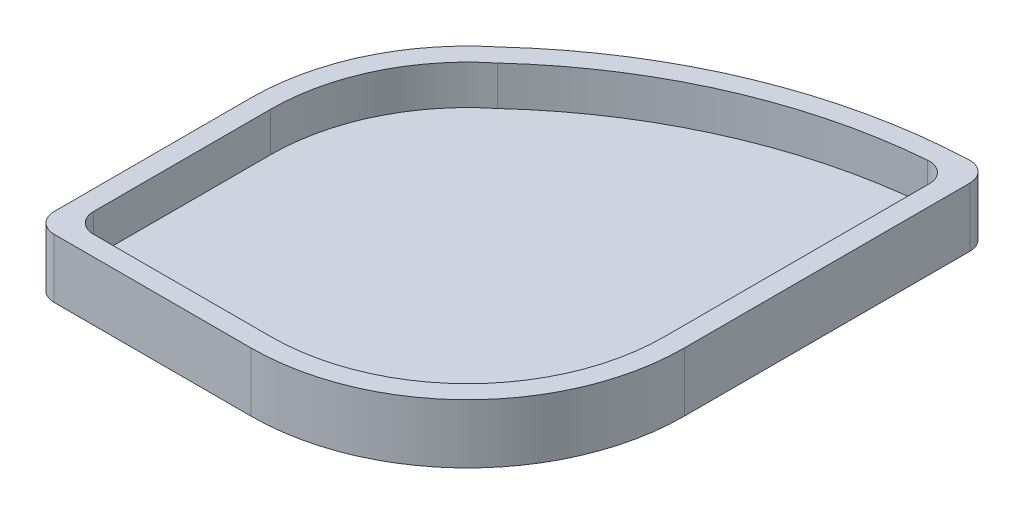
ISO-10303-21;
HEADER;
FILE_DESCRIPTION(('STEP AP214'),'2;1');
FILE_NAME('part.step','',(''),(''),'','','');
FILE_SCHEMA(('AUTOMOTIVE_DESIGN { 1 0 10303 214 1 1 1 1 }'));
ENDSEC;
DATA;
#1=APPLICATION_CONTEXT('core data for automotive mechanical design processes');
#2=APPLICATION_PROTOCOL_DEFINITION('international standard','automotive_design',2000,#1);
#3=PRODUCT_CONTEXT('',#1,'mechanical');
#4=PRODUCT('Part','Part','',(#3));
#5=PRODUCT_RELATED_PRODUCT_CATEGORY('part','',(#4));
#6=PRODUCT_DEFINITION_FORMATION('','',#4);
#7=PRODUCT_DEFINITION_CONTEXT('part definition',#1,'design');
#8=PRODUCT_DEFINITION('design','',#6,#7);
#9=PRODUCT_DEFINITION_SHAPE('','',#8);
#10=(LENGTH_UNIT() NAMED_UNIT(*) SI_UNIT(.MILLI.,.METRE.));
#11=(NAMED_UNIT(*) PLANE_ANGLE_UNIT() SI_UNIT($,.RADIAN.));
#12=(NAMED_UNIT(*) SI_UNIT($,.STERADIAN.) SOLID_ANGLE_UNIT());
#13=UNCERTAINTY_MEASURE_WITH_UNIT(LENGTH_MEASURE(1.E-05),#10,'distance_accuracy_value','');
#14=(GEOMETRIC_REPRESENTATION_CONTEXT(3) GLOBAL_UNCERTAINTY_ASSIGNED_CONTEXT((#13)) GLOBAL_UNIT_ASSIGNED_CONTEXT((#10,
#11,#12)) REPRESENTATION_CONTEXT('',''));
#15=CARTESIAN_POINT('',(0.,0.,0.));
#16=DIRECTION('',(0.,0.,1.));
#17=DIRECTION('',(1.,0.,0.));
#18=AXIS2_PLACEMENT_3D('',#15,#16,#17);
#19=CARTESIAN_POINT('',(0.,5.,0.));
#20=DIRECTION('',(0.,1.,0.));
#21=DIRECTION('',(0.,0.,1.));
#22=AXIS2_PLACEMENT_3D('',#19,#20,#21);
#23=CYLINDRICAL_SURFACE('',#22,50.);
#24=DIRECTION('',(0.,1.,0.));
#25=VECTOR('',#24,1.);
#26=CARTESIAN_POINT('',(0.,5.,50.));
#27=LINE('',#26,#25);
#28=CARTESIAN_POINT('',(0.,5.,50.));
#29=VERTEX_POINT('',#28);
#30=CARTESIAN_POINT('',(0.,15.,50.));
#31=VERTEX_POINT('',#30);
#32=EDGE_CURVE('E187',#29,#31,#27,.T.);
#33=ORIENTED_EDGE('',*,*,#32,.T.);
#34=CARTESIAN_POINT('',(0.,15.,0.));
#35=DIRECTION('',(0.,1.,0.));
#36=DIRECTION('',(0.,0.,1.));
#37=AXIS2_PLACEMENT_3D('',#34,#35,#36);
#38=CIRCLE('',#37,50.);
#39=CARTESIAN_POINT('',(50.,15.,0.));
#40=VERTEX_POINT('',#39);
#41=EDGE_CURVE('E204',#31,#40,#38,.T.);
#42=ORIENTED_EDGE('',*,*,#41,.T.);
#43=DIRECTION('',(0.,1.,0.));
#44=VECTOR('',#43,1.);
#45=CARTESIAN_POINT('',(50.,5.,0.));
#46=LINE('',#45,#44);
#47=CARTESIAN_POINT('',(50.,5.,0.));
#48=VERTEX_POINT('',#47);
#49=EDGE_CURVE('E277',#48,#40,#46,.T.);
#50=ORIENTED_EDGE('',*,*,#49,.F.);
#51=CARTESIAN_POINT('',(0.,5.,0.));
#52=DIRECTION('',(0.,1.,0.));
#53=DIRECTION('',(0.,0.,1.));
#54=AXIS2_PLACEMENT_3D('',#51,#52,#53);
#55=CIRCLE('',#54,50.);
#56=EDGE_CURVE('E195',#29,#48,#55,.T.);
#57=ORIENTED_EDGE('',*,*,#56,.F.);
#58=EDGE_LOOP('',(#33,#42,#50,#57));
#59=FACE_BOUND('',#58,.T.);
#60=ADVANCED_FACE('F52',(#59),#23,.F.);
#61=CARTESIAN_POINT('',(0.,15.,0.));
#62=DIRECTION('',(0.,-1.,0.));
#63=DIRECTION('',(0.,0.,-1.));
#64=AXIS2_PLACEMENT_3D('',#61,#62,#63);
#65=CYLINDRICAL_SURFACE('',#64,55.);
#66=DIRECTION('',(0.,-1.,0.));
#67=VECTOR('',#66,1.);
#68=CARTESIAN_POINT('',(-55.,15.,0.));
#69=LINE('',#68,#67);
#70=CARTESIAN_POINT('',(-55.,15.,0.));
#71=VERTEX_POINT('',#70);
#72=CARTESIAN_POINT('',(-55.,0.,0.));
#73=VERTEX_POINT('',#72);
#74=EDGE_CURVE('E258',#71,#73,#69,.T.);
#75=ORIENTED_EDGE('',*,*,#74,.F.);
#76=CARTESIAN_POINT('',(0.,15.,0.));
#77=DIRECTION('',(0.,1.,0.));
#78=DIRECTION('',(0.,0.,1.));
#79=AXIS2_PLACEMENT_3D('',#76,#77,#78);
#80=CIRCLE('',#79,55.);
#81=CARTESIAN_POINT('',(-34.617130436299,15.,-42.7393762279734));
#82=VERTEX_POINT('',#81);
#83=EDGE_CURVE('E205',#82,#71,#80,.T.);
#84=ORIENTED_EDGE('',*,*,#83,.F.);
#85=DIRECTION('',(0.,-1.,0.));
#86=VECTOR('',#85,1.);
#87=CARTESIAN_POINT('',(-34.617130436299,15.,-42.7393762279734));
#88=LINE('',#87,#86);
#89=CARTESIAN_POINT('',(-34.617130436299,0.,-42.7393762279734));
#90=VERTEX_POINT('',#89);
#91=EDGE_CURVE('E201',#82,#90,#88,.T.);
#92=ORIENTED_EDGE('',*,*,#91,.T.);
#93=CARTESIAN_POINT('',(0.,0.,0.));
#94=DIRECTION('',(0.,1.,0.));
#95=DIRECTION('',(0.,0.,1.));
#96=AXIS2_PLACEMENT_3D('',#93,#94,#95);
#97=CIRCLE('',#96,55.);
#98=EDGE_CURVE('E197',#90,#73,#97,.T.);
#99=ORIENTED_EDGE('',*,*,#98,.T.);
#100=EDGE_LOOP('',(#75,#84,#92,#99));
#101=FACE_BOUND('',#100,.T.);
#102=ADVANCED_FACE('F336',(#101),#65,.T.);
#103=CARTESIAN_POINT('',(0.,15.,55.));
#104=VERTEX_POINT('',#103);
#105=CARTESIAN_POINT('',(55.,15.,0.));
#106=VERTEX_POINT('',#105);
#107=EDGE_CURVE('E208',#104,#106,#80,.T.);
#108=ORIENTED_EDGE('',*,*,#107,.F.);
#109=DIRECTION('',(0.,-1.,0.));
#110=VECTOR('',#109,1.);
#111=CARTESIAN_POINT('',(0.,15.,55.));
#112=LINE('',#111,#110);
#113=CARTESIAN_POINT('',(0.,0.,55.));
#114=VERTEX_POINT('',#113);
#115=EDGE_CURVE('E254',#104,#114,#112,.T.);
#116=ORIENTED_EDGE('',*,*,#115,.T.);
#117=CARTESIAN_POINT('',(55.,0.,0.));
#118=VERTEX_POINT('',#117);
#119=EDGE_CURVE('E194',#114,#118,#97,.T.);
#120=ORIENTED_EDGE('',*,*,#119,.T.);
#121=DIRECTION('',(0.,-1.,0.));
#122=VECTOR('',#121,1.);
#123=CARTESIAN_POINT('',(55.,15.,5.76094420909117E-13));
#124=LINE('',#123,#122);
#125=EDGE_CURVE('E263',#106,#118,#124,.T.);
#126=ORIENTED_EDGE('',*,*,#125,.F.);
#127=EDGE_LOOP('',(#108,#116,#120,#126));
#128=FACE_BOUND('',#127,.T.);
#129=ADVANCED_FACE('F341',(#128),#65,.T.);
#130=CARTESIAN_POINT('',(0.,15.,0.));
#131=DIRECTION('',(0.,1.,0.));
#132=DIRECTION('',(0.,0.,1.));
#133=AXIS2_PLACEMENT_3D('',#130,#131,#132);
#134=PLANE('',#133);
#135=DIRECTION('',(1.,0.,0.));
#136=VECTOR('',#135,1.);
#137=CARTESIAN_POINT('',(0.,15.,50.));
#138=LINE('',#137,#136);
#139=CARTESIAN_POINT('',(-45.,15.,50.));
#140=VERTEX_POINT('',#139);
#141=EDGE_CURVE('E177',#140,#31,#138,.T.);
#142=ORIENTED_EDGE('',*,*,#141,.F.);
#143=CARTESIAN_POINT('',(-45.,15.,45.));
#144=DIRECTION('',(0.,1.,0.));
#145=DIRECTION('',(0.,0.,1.));
#146=AXIS2_PLACEMENT_3D('',#143,#144,#145);
#147=CIRCLE('',#146,5.);
#148=CARTESIAN_POINT('',(-50.,15.,45.));
#149=VERTEX_POINT('',#148);
#150=EDGE_CURVE('E215',#140,#149,#147,.F.);
#151=ORIENTED_EDGE('',*,*,#150,.T.);
#152=DIRECTION('',(0.,0.,1.));
#153=VECTOR('',#152,1.);
#154=CARTESIAN_POINT('',(-50.,15.,0.));
#155=LINE('',#154,#153);
#156=CARTESIAN_POINT('',(-50.,15.,0.));
#157=VERTEX_POINT('',#156);
#158=EDGE_CURVE('E297',#157,#149,#155,.T.);
#159=ORIENTED_EDGE('',*,*,#158,.F.);
#160=CARTESIAN_POINT('',(-31.3525600894295,15.,-38.9489021133936));
#161=VERTEX_POINT('',#160);
#162=EDGE_CURVE('E186',#161,#157,#38,.T.);
#163=ORIENTED_EDGE('',*,*,#162,.F.);
#164=CARTESIAN_POINT('',(55.,15.,55.));
#165=DIRECTION('',(0.,1.,0.));
#166=DIRECTION('',(0.,0.,1.));
#167=AXIS2_PLACEMENT_3D('',#164,#165,#166);
#168=CIRCLE('',#167,127.605489075943);
#169=CARTESIAN_POINT('',(44.5921879160807,15.,-72.180337670319));
#170=VERTEX_POINT('',#169);
#171=EDGE_CURVE('E286',#170,#161,#168,.T.);
#172=ORIENTED_EDGE('',*,*,#171,.F.);
#173=CARTESIAN_POINT('',(45.,15.,-67.1969964915305));
#174=DIRECTION('',(0.,1.,0.));
#175=DIRECTION('',(0.,0.,1.));
#176=AXIS2_PLACEMENT_3D('',#173,#174,#175);
#177=CIRCLE('',#176,5.);
#178=CARTESIAN_POINT('',(50.,15.,-67.1969964915305));
#179=VERTEX_POINT('',#178);
#180=EDGE_CURVE('E224',#170,#179,#177,.F.);
#181=ORIENTED_EDGE('',*,*,#180,.T.);
#182=DIRECTION('',(0.,0.,-1.));
#183=VECTOR('',#182,1.);
#184=CARTESIAN_POINT('',(50.,15.,0.));
#185=LINE('',#184,#183);
#186=EDGE_CURVE('E289',#40,#179,#185,.T.);
#187=ORIENTED_EDGE('',*,*,#186,.F.);
#188=ORIENTED_EDGE('',*,*,#41,.F.);
#189=EDGE_LOOP('',(#142,#151,#159,#163,#172,#181,#187,#188));
#190=FACE_BOUND('',#189,.T.);
#191=DIRECTION('',(0.,0.,1.));
#192=VECTOR('',#191,1.);
#193=CARTESIAN_POINT('',(-55.,15.,0.));
#194=LINE('',#193,#192);
#195=CARTESIAN_POINT('',(-55.,15.,50.));
#196=VERTEX_POINT('',#195);
#197=EDGE_CURVE('E273',#71,#196,#194,.T.);
#198=ORIENTED_EDGE('',*,*,#197,.T.);
#199=CARTESIAN_POINT('',(-50.,15.,50.));
#200=DIRECTION('',(0.,1.,0.));
#201=DIRECTION('',(0.,0.,1.));
#202=AXIS2_PLACEMENT_3D('',#199,#200,#201);
#203=CIRCLE('',#202,5.);
#204=CARTESIAN_POINT('',(-50.,15.,55.));
#205=VERTEX_POINT('',#204);
#206=EDGE_CURVE('E236',#196,#205,#203,.T.);
#207=ORIENTED_EDGE('',*,*,#206,.T.);
#208=DIRECTION('',(-1.,0.,0.));
#209=VECTOR('',#208,1.);
#210=CARTESIAN_POINT('',(0.,15.,55.));
#211=LINE('',#210,#209);
#212=EDGE_CURVE('E269',#104,#205,#211,.T.);
#213=ORIENTED_EDGE('',*,*,#212,.F.);
#214=ORIENTED_EDGE('',*,*,#107,.T.);
#215=DIRECTION('',(0.,0.,-1.));
#216=VECTOR('',#215,1.);
#217=CARTESIAN_POINT('',(55.,15.,0.));
#218=LINE('',#217,#216);
#219=CARTESIAN_POINT('',(55.,15.,-72.507493279064));
#220=VERTEX_POINT('',#219);
#221=EDGE_CURVE('E261',#106,#220,#218,.T.);
#222=ORIENTED_EDGE('',*,*,#221,.T.);
#223=CARTESIAN_POINT('',(50.,15.,-72.507493279064));
#224=DIRECTION('',(0.,1.,0.));
#225=DIRECTION('',(0.,0.,1.));
#226=AXIS2_PLACEMENT_3D('',#223,#224,#225);
#227=CIRCLE('',#226,5.);
#228=CARTESIAN_POINT('',(49.8040836630067,15.,-77.5036534835509));
#229=VERTEX_POINT('',#228);
#230=EDGE_CURVE('E67',#220,#229,#227,.T.);
#231=ORIENTED_EDGE('',*,*,#230,.T.);
#232=CARTESIAN_POINT('',(55.,15.,55.));
#233=DIRECTION('',(0.,-1.,0.));
#234=DIRECTION('',(0.,0.,-1.));
#235=AXIS2_PLACEMENT_3D('',#232,#233,#234);
#236=CIRCLE('',#235,132.605489075943);
#237=EDGE_CURVE('E245',#82,#229,#236,.T.);
#238=ORIENTED_EDGE('',*,*,#237,.F.);
#239=ORIENTED_EDGE('',*,*,#83,.T.);
#240=EDGE_LOOP('',(#198,#207,#213,#214,#222,#231,#238,#239));
#241=FACE_BOUND('',#240,.T.);
#242=ADVANCED_FACE('F315',(#190,#241),#134,.T.);
#243=CARTESIAN_POINT('',(0.,0.,0.));
#244=DIRECTION('',(0.,1.,0.));
#245=DIRECTION('',(0.,0.,1.));
#246=AXIS2_PLACEMENT_3D('',#243,#244,#245);
#247=PLANE('',#246);
#248=DIRECTION('',(-1.,0.,0.));
#249=VECTOR('',#248,1.);
#250=CARTESIAN_POINT('',(0.,0.,55.));
#251=LINE('',#250,#249);
#252=CARTESIAN_POINT('',(-50.,0.,55.));
#253=VERTEX_POINT('',#252);
#254=EDGE_CURVE('E271',#114,#253,#251,.T.);
#255=ORIENTED_EDGE('',*,*,#254,.T.);
#256=CARTESIAN_POINT('',(-50.,0.,50.));
#257=DIRECTION('',(0.,1.,0.));
#258=DIRECTION('',(0.,0.,1.));
#259=AXIS2_PLACEMENT_3D('',#256,#257,#258);
#260=CIRCLE('',#259,5.);
#261=CARTESIAN_POINT('',(-55.,0.,50.));
#262=VERTEX_POINT('',#261);
#263=EDGE_CURVE('E231',#253,#262,#260,.F.);
#264=ORIENTED_EDGE('',*,*,#263,.T.);
#265=DIRECTION('',(0.,0.,1.));
#266=VECTOR('',#265,1.);
#267=CARTESIAN_POINT('',(-55.,0.,0.));
#268=LINE('',#267,#266);
#269=EDGE_CURVE('E274',#73,#262,#268,.T.);
#270=ORIENTED_EDGE('',*,*,#269,.F.);
#271=ORIENTED_EDGE('',*,*,#98,.F.);
#272=CARTESIAN_POINT('',(55.,0.,55.));
#273=DIRECTION('',(0.,-1.,0.));
#274=DIRECTION('',(0.,0.,-1.));
#275=AXIS2_PLACEMENT_3D('',#272,#273,#274);
#276=CIRCLE('',#275,132.605489075943);
#277=CARTESIAN_POINT('',(49.8040836630067,0.,-77.5036534835509));
#278=VERTEX_POINT('',#277);
#279=EDGE_CURVE('E244',#90,#278,#276,.T.);
#280=ORIENTED_EDGE('',*,*,#279,.T.);
#281=CARTESIAN_POINT('',(50.,0.,-72.507493279064));
#282=DIRECTION('',(0.,1.,0.));
#283=DIRECTION('',(0.,0.,1.));
#284=AXIS2_PLACEMENT_3D('',#281,#282,#283);
#285=CIRCLE('',#284,5.);
#286=CARTESIAN_POINT('',(55.,0.,-72.507493279064));
#287=VERTEX_POINT('',#286);
#288=EDGE_CURVE('E229',#278,#287,#285,.F.);
#289=ORIENTED_EDGE('',*,*,#288,.T.);
#290=DIRECTION('',(0.,0.,-1.));
#291=VECTOR('',#290,1.);
#292=CARTESIAN_POINT('',(55.,0.,0.));
#293=LINE('',#292,#291);
#294=EDGE_CURVE('E253',#118,#287,#293,.T.);
#295=ORIENTED_EDGE('',*,*,#294,.F.);
#296=ORIENTED_EDGE('',*,*,#119,.F.);
#297=EDGE_LOOP('',(#255,#264,#270,#271,#280,#289,#295,#296));
#298=FACE_BOUND('',#297,.T.);
#299=ADVANCED_FACE('F249',(#298),#247,.F.);
#300=ORIENTED_EDGE('',*,*,#162,.T.);
#301=DIRECTION('',(0.,1.,0.));
#302=VECTOR('',#301,1.);
#303=CARTESIAN_POINT('',(-50.,5.,0.));
#304=LINE('',#303,#302);
#305=CARTESIAN_POINT('',(-50.,5.,0.));
#306=VERTEX_POINT('',#305);
#307=EDGE_CURVE('E169',#306,#157,#304,.T.);
#308=ORIENTED_EDGE('',*,*,#307,.F.);
#309=CARTESIAN_POINT('',(-31.3525600894295,5.,-38.9489021133936));
#310=VERTEX_POINT('',#309);
#311=EDGE_CURVE('E184',#310,#306,#55,.T.);
#312=ORIENTED_EDGE('',*,*,#311,.F.);
#313=DIRECTION('',(0.,1.,0.));
#314=VECTOR('',#313,1.);
#315=CARTESIAN_POINT('',(-31.3525600894295,5.,-38.9489021133936));
#316=LINE('',#315,#314);
#317=EDGE_CURVE('E282',#310,#161,#316,.T.);
#318=ORIENTED_EDGE('',*,*,#317,.T.);
#319=EDGE_LOOP('',(#300,#308,#312,#318));
#320=FACE_BOUND('',#319,.T.);
#321=ADVANCED_FACE('F182',(#320),#23,.F.);
#322=CARTESIAN_POINT('',(0.,5.,0.));
#323=DIRECTION('',(0.,1.,0.));
#324=DIRECTION('',(0.,0.,1.));
#325=AXIS2_PLACEMENT_3D('',#322,#323,#324);
#326=PLANE('',#325);
#327=DIRECTION('',(0.,0.,-1.));
#328=VECTOR('',#327,1.);
#329=CARTESIAN_POINT('',(50.,5.,0.));
#330=LINE('',#329,#328);
#331=CARTESIAN_POINT('',(50.,5.,-67.1969964915305));
#332=VERTEX_POINT('',#331);
#333=EDGE_CURVE('E288',#48,#332,#330,.T.);
#334=ORIENTED_EDGE('',*,*,#333,.T.);
#335=CARTESIAN_POINT('',(45.,5.,-67.1969964915305));
#336=DIRECTION('',(0.,1.,0.));
#337=DIRECTION('',(0.,0.,1.));
#338=AXIS2_PLACEMENT_3D('',#335,#336,#337);
#339=CIRCLE('',#338,5.);
#340=CARTESIAN_POINT('',(44.5921879160807,5.,-72.180337670319));
#341=VERTEX_POINT('',#340);
#342=EDGE_CURVE('E222',#332,#341,#339,.T.);
#343=ORIENTED_EDGE('',*,*,#342,.T.);
#344=CARTESIAN_POINT('',(55.,5.,55.));
#345=DIRECTION('',(0.,1.,0.));
#346=DIRECTION('',(0.,0.,1.));
#347=AXIS2_PLACEMENT_3D('',#344,#345,#346);
#348=CIRCLE('',#347,127.605489075943);
#349=EDGE_CURVE('E192',#341,#310,#348,.T.);
#350=ORIENTED_EDGE('',*,*,#349,.T.);
#351=ORIENTED_EDGE('',*,*,#311,.T.);
#352=DIRECTION('',(0.,0.,1.));
#353=VECTOR('',#352,1.);
#354=CARTESIAN_POINT('',(-50.,5.,0.));
#355=LINE('',#354,#353);
#356=CARTESIAN_POINT('',(-50.,5.,45.));
#357=VERTEX_POINT('',#356);
#358=EDGE_CURVE('E165',#306,#357,#355,.T.);
#359=ORIENTED_EDGE('',*,*,#358,.T.);
#360=CARTESIAN_POINT('',(-45.,5.,45.));
#361=DIRECTION('',(0.,1.,0.));
#362=DIRECTION('',(0.,0.,1.));
#363=AXIS2_PLACEMENT_3D('',#360,#361,#362);
#364=CIRCLE('',#363,5.);
#365=CARTESIAN_POINT('',(-45.,5.,50.));
#366=VERTEX_POINT('',#365);
#367=EDGE_CURVE('E213',#357,#366,#364,.T.);
#368=ORIENTED_EDGE('',*,*,#367,.T.);
#369=DIRECTION('',(1.,0.,0.));
#370=VECTOR('',#369,1.);
#371=CARTESIAN_POINT('',(0.,5.,50.));
#372=LINE('',#371,#370);
#373=EDGE_CURVE('E176',#366,#29,#372,.T.);
#374=ORIENTED_EDGE('',*,*,#373,.T.);
#375=ORIENTED_EDGE('',*,*,#56,.T.);
#376=EDGE_LOOP('',(#334,#343,#350,#351,#359,#368,#374,#375));
#377=FACE_BOUND('',#376,.T.);
#378=ADVANCED_FACE('F190',(#377),#326,.T.);
#379=CARTESIAN_POINT('',(55.,15.,0.));
#380=DIRECTION('',(-1.,0.,0.));
#381=DIRECTION('',(0.,0.,1.));
#382=AXIS2_PLACEMENT_3D('',#379,#380,#381);
#383=PLANE('',#382);
#384=ORIENTED_EDGE('',*,*,#294,.T.);
#385=DIRECTION('',(0.,1.,0.));
#386=VECTOR('',#385,1.);
#387=CARTESIAN_POINT('',(55.,15.,-72.507493279064));
#388=LINE('',#387,#386);
#389=EDGE_CURVE('E12',#287,#220,#388,.T.);
#390=ORIENTED_EDGE('',*,*,#389,.T.);
#391=ORIENTED_EDGE('',*,*,#221,.F.);
#392=ORIENTED_EDGE('',*,*,#125,.T.);
#393=EDGE_LOOP('',(#384,#390,#391,#392));
#394=FACE_BOUND('',#393,.T.);
#395=ADVANCED_FACE('F349',(#394),#383,.F.);
#396=CARTESIAN_POINT('',(55.,15.,55.));
#397=DIRECTION('',(0.,-1.,0.));
#398=DIRECTION('',(0.,0.,-1.));
#399=AXIS2_PLACEMENT_3D('',#396,#397,#398);
#400=CYLINDRICAL_SURFACE('',#399,132.605489075943);
#401=ORIENTED_EDGE('',*,*,#237,.T.);
#402=DIRECTION('',(0.,-1.,0.));
#403=VECTOR('',#402,1.);
#404=CARTESIAN_POINT('',(49.8040836630067,15.,-77.5036534835509));
#405=LINE('',#404,#403);
#406=EDGE_CURVE('E60',#229,#278,#405,.T.);
#407=ORIENTED_EDGE('',*,*,#406,.T.);
#408=ORIENTED_EDGE('',*,*,#279,.F.);
#409=ORIENTED_EDGE('',*,*,#91,.F.);
#410=EDGE_LOOP('',(#401,#407,#408,#409));
#411=FACE_BOUND('',#410,.T.);
#412=ADVANCED_FACE('F242',(#411),#400,.T.);
#413=CARTESIAN_POINT('',(-55.,15.,0.));
#414=DIRECTION('',(1.,0.,0.));
#415=DIRECTION('',(0.,0.,-1.));
#416=AXIS2_PLACEMENT_3D('',#413,#414,#415);
#417=PLANE('',#416);
#418=ORIENTED_EDGE('',*,*,#269,.T.);
#419=DIRECTION('',(0.,-1.,0.));
#420=VECTOR('',#419,1.);
#421=CARTESIAN_POINT('',(-55.,15.,50.));
#422=LINE('',#421,#420);
#423=EDGE_CURVE('E233',#262,#196,#422,.F.);
#424=ORIENTED_EDGE('',*,*,#423,.T.);
#425=ORIENTED_EDGE('',*,*,#197,.F.);
#426=ORIENTED_EDGE('',*,*,#74,.T.);
#427=EDGE_LOOP('',(#418,#424,#425,#426));
#428=FACE_BOUND('',#427,.T.);
#429=ADVANCED_FACE('F414',(#428),#417,.F.);
#430=CARTESIAN_POINT('',(0.,15.,55.));
#431=DIRECTION('',(0.,0.,1.));
#432=DIRECTION('',(1.,0.,0.));
#433=AXIS2_PLACEMENT_3D('',#430,#431,#432);
#434=PLANE('',#433);
#435=ORIENTED_EDGE('',*,*,#212,.T.);
#436=DIRECTION('',(0.,-1.,0.));
#437=VECTOR('',#436,1.);
#438=CARTESIAN_POINT('',(-50.,0.,55.));
#439=LINE('',#438,#437);
#440=EDGE_CURVE('E226',#205,#253,#439,.T.);
#441=ORIENTED_EDGE('',*,*,#440,.T.);
#442=ORIENTED_EDGE('',*,*,#254,.F.);
#443=ORIENTED_EDGE('',*,*,#115,.F.);
#444=EDGE_LOOP('',(#435,#441,#442,#443));
#445=FACE_BOUND('',#444,.T.);
#446=ADVANCED_FACE('F362',(#445),#434,.T.);
#447=CARTESIAN_POINT('',(50.,5.,0.));
#448=DIRECTION('',(1.,0.,0.));
#449=DIRECTION('',(0.,0.,-1.));
#450=AXIS2_PLACEMENT_3D('',#447,#448,#449);
#451=PLANE('',#450);
#452=ORIENTED_EDGE('',*,*,#186,.T.);
#453=DIRECTION('',(0.,-1.,0.));
#454=VECTOR('',#453,1.);
#455=CARTESIAN_POINT('',(50.,5.,-67.1969964915305));
#456=LINE('',#455,#454);
#457=EDGE_CURVE('E220',#179,#332,#456,.T.);
#458=ORIENTED_EDGE('',*,*,#457,.T.);
#459=ORIENTED_EDGE('',*,*,#333,.F.);
#460=ORIENTED_EDGE('',*,*,#49,.T.);
#461=EDGE_LOOP('',(#452,#458,#459,#460));
#462=FACE_BOUND('',#461,.T.);
#463=ADVANCED_FACE('F312',(#462),#451,.F.);
#464=CARTESIAN_POINT('',(55.,5.,55.));
#465=DIRECTION('',(0.,1.,0.));
#466=DIRECTION('',(0.,0.,1.));
#467=AXIS2_PLACEMENT_3D('',#464,#465,#466);
#468=CYLINDRICAL_SURFACE('',#467,127.605489075943);
#469=ORIENTED_EDGE('',*,*,#349,.F.);
#470=DIRECTION('',(0.,1.,0.));
#471=VECTOR('',#470,1.);
#472=CARTESIAN_POINT('',(44.5921879160807,5.,-72.180337670319));
#473=LINE('',#472,#471);
#474=EDGE_CURVE('E217',#341,#170,#473,.T.);
#475=ORIENTED_EDGE('',*,*,#474,.T.);
#476=ORIENTED_EDGE('',*,*,#171,.T.);
#477=ORIENTED_EDGE('',*,*,#317,.F.);
#478=EDGE_LOOP('',(#469,#475,#476,#477));
#479=FACE_BOUND('',#478,.T.);
#480=ADVANCED_FACE('F322',(#479),#468,.F.);
#481=CARTESIAN_POINT('',(0.,5.,50.));
#482=DIRECTION('',(0.,0.,1.));
#483=DIRECTION('',(1.,0.,0.));
#484=AXIS2_PLACEMENT_3D('',#481,#482,#483);
#485=PLANE('',#484);
#486=ORIENTED_EDGE('',*,*,#373,.F.);
#487=DIRECTION('',(0.,1.,0.));
#488=VECTOR('',#487,1.);
#489=CARTESIAN_POINT('',(-45.,15.,50.));
#490=LINE('',#489,#488);
#491=EDGE_CURVE('E207',#366,#140,#490,.T.);
#492=ORIENTED_EDGE('',*,*,#491,.T.);
#493=ORIENTED_EDGE('',*,*,#141,.T.);
#494=ORIENTED_EDGE('',*,*,#32,.F.);
#495=EDGE_LOOP('',(#486,#492,#493,#494));
#496=FACE_BOUND('',#495,.T.);
#497=ADVANCED_FACE('F305',(#496),#485,.F.);
#498=CARTESIAN_POINT('',(-50.,5.,0.));
#499=DIRECTION('',(-1.,0.,0.));
#500=DIRECTION('',(0.,0.,1.));
#501=AXIS2_PLACEMENT_3D('',#498,#499,#500);
#502=PLANE('',#501);
#503=ORIENTED_EDGE('',*,*,#158,.T.);
#504=DIRECTION('',(0.,1.,0.));
#505=VECTOR('',#504,1.);
#506=CARTESIAN_POINT('',(-50.,5.,45.));
#507=LINE('',#506,#505);
#508=EDGE_CURVE('E172',#149,#357,#507,.F.);
#509=ORIENTED_EDGE('',*,*,#508,.T.);
#510=ORIENTED_EDGE('',*,*,#358,.F.);
#511=ORIENTED_EDGE('',*,*,#307,.T.);
#512=EDGE_LOOP('',(#503,#509,#510,#511));
#513=FACE_BOUND('',#512,.T.);
#514=ADVANCED_FACE('F168',(#513),#502,.F.);
#515=CARTESIAN_POINT('',(-45.,5.,45.));
#516=DIRECTION('',(0.,-1.,0.));
#517=DIRECTION('',(0.,0.,-1.));
#518=AXIS2_PLACEMENT_3D('',#515,#516,#517);
#519=CYLINDRICAL_SURFACE('',#518,5.);
#520=ORIENTED_EDGE('',*,*,#367,.F.);
#521=ORIENTED_EDGE('',*,*,#508,.F.);
#522=ORIENTED_EDGE('',*,*,#150,.F.);
#523=ORIENTED_EDGE('',*,*,#491,.F.);
#524=EDGE_LOOP('',(#520,#521,#522,#523));
#525=FACE_BOUND('',#524,.T.);
#526=ADVANCED_FACE('F324',(#525),#519,.F.);
#527=CARTESIAN_POINT('',(45.,5.,-67.1969964915305));
#528=DIRECTION('',(0.,1.,0.));
#529=DIRECTION('',(0.,0.,1.));
#530=AXIS2_PLACEMENT_3D('',#527,#528,#529);
#531=CYLINDRICAL_SURFACE('',#530,5.);
#532=ORIENTED_EDGE('',*,*,#342,.F.);
#533=ORIENTED_EDGE('',*,*,#457,.F.);
#534=ORIENTED_EDGE('',*,*,#180,.F.);
#535=ORIENTED_EDGE('',*,*,#474,.F.);
#536=EDGE_LOOP('',(#532,#533,#534,#535));
#537=FACE_BOUND('',#536,.T.);
#538=ADVANCED_FACE('F320',(#537),#531,.F.);
#539=CARTESIAN_POINT('',(-50.,15.,50.));
#540=DIRECTION('',(0.,1.,0.));
#541=DIRECTION('',(0.,0.,1.));
#542=AXIS2_PLACEMENT_3D('',#539,#540,#541);
#543=CYLINDRICAL_SURFACE('',#542,5.);
#544=ORIENTED_EDGE('',*,*,#206,.F.);
#545=ORIENTED_EDGE('',*,*,#423,.F.);
#546=ORIENTED_EDGE('',*,*,#263,.F.);
#547=ORIENTED_EDGE('',*,*,#440,.F.);
#548=EDGE_LOOP('',(#544,#545,#546,#547));
#549=FACE_BOUND('',#548,.T.);
#550=ADVANCED_FACE('F331',(#549),#543,.T.);
#551=CARTESIAN_POINT('',(50.,15.,-72.507493279064));
#552=DIRECTION('',(0.,-1.,0.));
#553=DIRECTION('',(0.,0.,-1.));
#554=AXIS2_PLACEMENT_3D('',#551,#552,#553);
#555=CYLINDRICAL_SURFACE('',#554,5.);
#556=ORIENTED_EDGE('',*,*,#230,.F.);
#557=ORIENTED_EDGE('',*,*,#389,.F.);
#558=ORIENTED_EDGE('',*,*,#288,.F.);
#559=ORIENTED_EDGE('',*,*,#406,.F.);
#560=EDGE_LOOP('',(#556,#557,#558,#559));
#561=FACE_BOUND('',#560,.T.);
#562=ADVANCED_FACE('F54',(#561),#555,.T.);
#563=CLOSED_SHELL('',(#60,#102,#129,#242,#299,#321,#378,#395,#412,#429,#446,#463,#480,#497,#514,
#526,#538,#550,#562));
#564=MANIFOLD_SOLID_BREP('B2',#563);
#565=ADVANCED_BREP_SHAPE_REPRESENTATION('',(#18,#564),#14);
#566=SHAPE_DEFINITION_REPRESENTATION(#9,#565);
ENDSEC;
END-ISO-10303-21;
